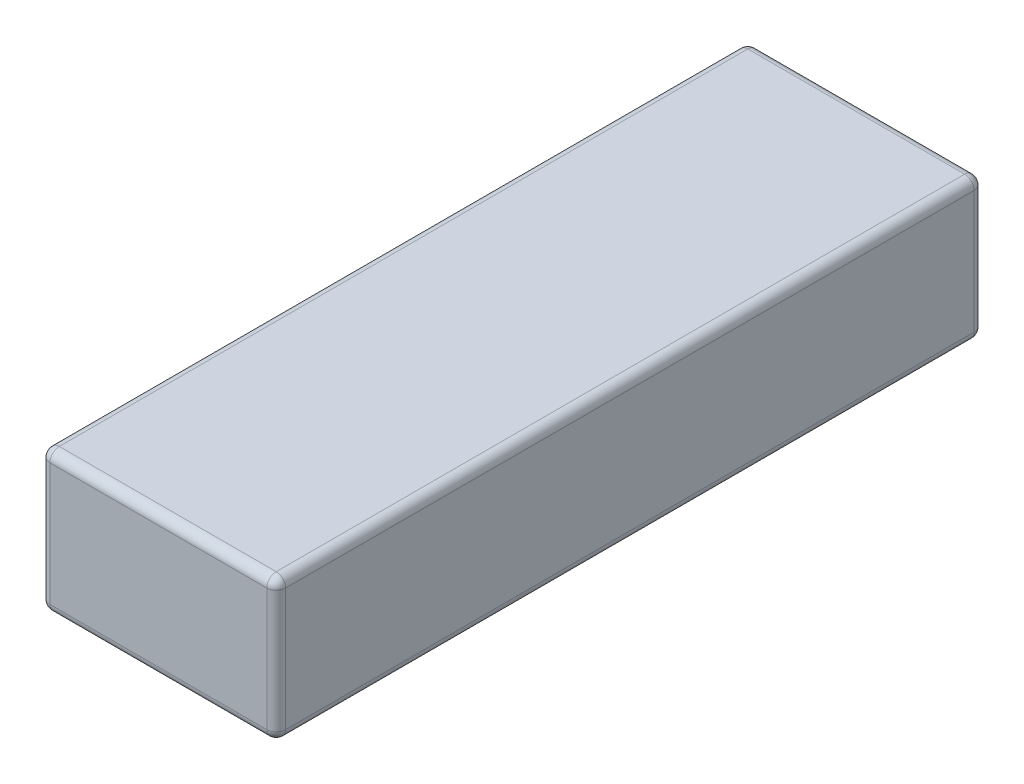
ISO-10303-21;
HEADER;
FILE_DESCRIPTION(('STEP AP214'),'2;1');
FILE_NAME('part.step','',(''),(''),'','','');
FILE_SCHEMA(('AUTOMOTIVE_DESIGN { 1 0 10303 214 1 1 1 1 }'));
ENDSEC;
DATA;
#1=APPLICATION_CONTEXT('core data for automotive mechanical design processes');
#2=APPLICATION_PROTOCOL_DEFINITION('international standard','automotive_design',2000,#1);
#3=PRODUCT_CONTEXT('',#1,'mechanical');
#4=PRODUCT('Part','Part','',(#3));
#5=PRODUCT_RELATED_PRODUCT_CATEGORY('part','',(#4));
#6=PRODUCT_DEFINITION_FORMATION('','',#4);
#7=PRODUCT_DEFINITION_CONTEXT('part definition',#1,'design');
#8=PRODUCT_DEFINITION('design','',#6,#7);
#9=PRODUCT_DEFINITION_SHAPE('','',#8);
#10=(LENGTH_UNIT() NAMED_UNIT(*) SI_UNIT(.MILLI.,.METRE.));
#11=(NAMED_UNIT(*) PLANE_ANGLE_UNIT() SI_UNIT($,.RADIAN.));
#12=(NAMED_UNIT(*) SI_UNIT($,.STERADIAN.) SOLID_ANGLE_UNIT());
#13=UNCERTAINTY_MEASURE_WITH_UNIT(LENGTH_MEASURE(1.E-05),#10,'distance_accuracy_value','');
#14=(GEOMETRIC_REPRESENTATION_CONTEXT(3) GLOBAL_UNCERTAINTY_ASSIGNED_CONTEXT((#13)) GLOBAL_UNIT_ASSIGNED_CONTEXT((#10,
#11,#12)) REPRESENTATION_CONTEXT('',''));
#15=CARTESIAN_POINT('',(0.,0.,0.));
#16=DIRECTION('',(0.,0.,1.));
#17=DIRECTION('',(1.,0.,0.));
#18=AXIS2_PLACEMENT_3D('',#15,#16,#17);
#19=CARTESIAN_POINT('',(25.,30.,-75.));
#20=DIRECTION('',(-1.,0.,0.));
#21=DIRECTION('',(0.,0.,1.));
#22=AXIS2_PLACEMENT_3D('',#19,#20,#21);
#23=PLANE('',#22);
#24=DIRECTION('',(0.,-1.,0.));
#25=VECTOR('',#24,1.);
#26=CARTESIAN_POINT('',(25.,30.,73.));
#27=LINE('',#26,#25);
#28=CARTESIAN_POINT('',(25.,28.,73.));
#29=VERTEX_POINT('',#28);
#30=CARTESIAN_POINT('',(25.,2.,73.));
#31=VERTEX_POINT('',#30);
#32=EDGE_CURVE('E142',#29,#31,#27,.T.);
#33=ORIENTED_EDGE('',*,*,#32,.T.);
#34=DIRECTION('',(0.,0.,-1.));
#35=VECTOR('',#34,1.);
#36=CARTESIAN_POINT('',(25.,2.,-75.));
#37=LINE('',#36,#35);
#38=CARTESIAN_POINT('',(25.,2.,-73.));
#39=VERTEX_POINT('',#38);
#40=EDGE_CURVE('E137',#31,#39,#37,.T.);
#41=ORIENTED_EDGE('',*,*,#40,.T.);
#42=DIRECTION('',(0.,-1.,0.));
#43=VECTOR('',#42,1.);
#44=CARTESIAN_POINT('',(25.,30.,-73.));
#45=LINE('',#44,#43);
#46=CARTESIAN_POINT('',(25.,28.,-73.));
#47=VERTEX_POINT('',#46);
#48=EDGE_CURVE('E132',#39,#47,#45,.F.);
#49=ORIENTED_EDGE('',*,*,#48,.T.);
#50=DIRECTION('',(0.,0.,-1.));
#51=VECTOR('',#50,1.);
#52=CARTESIAN_POINT('',(25.,28.,75.));
#53=LINE('',#52,#51);
#54=EDGE_CURVE('E134',#47,#29,#53,.F.);
#55=ORIENTED_EDGE('',*,*,#54,.T.);
#56=EDGE_LOOP('',(#33,#41,#49,#55));
#57=FACE_BOUND('',#56,.T.);
#58=ADVANCED_FACE('F43',(#57),#23,.F.);
#59=CARTESIAN_POINT('',(-25.,30.,-75.));
#60=DIRECTION('',(0.,0.,1.));
#61=DIRECTION('',(1.,0.,0.));
#62=AXIS2_PLACEMENT_3D('',#59,#60,#61);
#63=PLANE('',#62);
#64=DIRECTION('',(-1.,0.,0.));
#65=VECTOR('',#64,1.);
#66=CARTESIAN_POINT('',(25.,28.,-75.));
#67=LINE('',#66,#65);
#68=CARTESIAN_POINT('',(-23.,28.,-75.));
#69=VERTEX_POINT('',#68);
#70=CARTESIAN_POINT('',(23.,28.,-75.));
#71=VERTEX_POINT('',#70);
#72=EDGE_CURVE('E267',#69,#71,#67,.F.);
#73=ORIENTED_EDGE('',*,*,#72,.T.);
#74=DIRECTION('',(0.,-1.,0.));
#75=VECTOR('',#74,1.);
#76=CARTESIAN_POINT('',(23.,30.,-75.));
#77=LINE('',#76,#75);
#78=CARTESIAN_POINT('',(23.,2.,-75.));
#79=VERTEX_POINT('',#78);
#80=EDGE_CURVE('E166',#71,#79,#77,.T.);
#81=ORIENTED_EDGE('',*,*,#80,.T.);
#82=DIRECTION('',(-1.,0.,0.));
#83=VECTOR('',#82,1.);
#84=CARTESIAN_POINT('',(-25.,2.,-75.));
#85=LINE('',#84,#83);
#86=CARTESIAN_POINT('',(-23.,2.,-75.));
#87=VERTEX_POINT('',#86);
#88=EDGE_CURVE('E270',#79,#87,#85,.T.);
#89=ORIENTED_EDGE('',*,*,#88,.T.);
#90=DIRECTION('',(0.,-1.,0.));
#91=VECTOR('',#90,1.);
#92=CARTESIAN_POINT('',(-23.,30.,-75.));
#93=LINE('',#92,#91);
#94=EDGE_CURVE('E264',#87,#69,#93,.F.);
#95=ORIENTED_EDGE('',*,*,#94,.T.);
#96=EDGE_LOOP('',(#73,#81,#89,#95));
#97=FACE_BOUND('',#96,.T.);
#98=ADVANCED_FACE('F341',(#97),#63,.F.);
#99=CARTESIAN_POINT('',(-25.,30.,-75.));
#100=DIRECTION('',(1.,0.,0.));
#101=DIRECTION('',(0.,0.,-1.));
#102=AXIS2_PLACEMENT_3D('',#99,#100,#101);
#103=PLANE('',#102);
#104=DIRECTION('',(0.,0.,1.));
#105=VECTOR('',#104,1.);
#106=CARTESIAN_POINT('',(-25.,28.,-75.));
#107=LINE('',#106,#105);
#108=CARTESIAN_POINT('',(-25.,28.,73.));
#109=VERTEX_POINT('',#108);
#110=CARTESIAN_POINT('',(-25.,28.,-73.));
#111=VERTEX_POINT('',#110);
#112=EDGE_CURVE('E53',#109,#111,#107,.F.);
#113=ORIENTED_EDGE('',*,*,#112,.T.);
#114=DIRECTION('',(0.,-1.,0.));
#115=VECTOR('',#114,1.);
#116=CARTESIAN_POINT('',(-25.,30.,-73.));
#117=LINE('',#116,#115);
#118=CARTESIAN_POINT('',(-25.,2.,-73.));
#119=VERTEX_POINT('',#118);
#120=EDGE_CURVE('E11',#111,#119,#117,.T.);
#121=ORIENTED_EDGE('',*,*,#120,.T.);
#122=DIRECTION('',(0.,0.,1.));
#123=VECTOR('',#122,1.);
#124=CARTESIAN_POINT('',(-25.,2.,-75.));
#125=LINE('',#124,#123);
#126=CARTESIAN_POINT('',(-25.,2.,73.));
#127=VERTEX_POINT('',#126);
#128=EDGE_CURVE('E288',#119,#127,#125,.T.);
#129=ORIENTED_EDGE('',*,*,#128,.T.);
#130=DIRECTION('',(0.,-1.,0.));
#131=VECTOR('',#130,1.);
#132=CARTESIAN_POINT('',(-25.,30.,73.));
#133=LINE('',#132,#131);
#134=EDGE_CURVE('E64',#127,#109,#133,.F.);
#135=ORIENTED_EDGE('',*,*,#134,.T.);
#136=EDGE_LOOP('',(#113,#121,#129,#135));
#137=FACE_BOUND('',#136,.T.);
#138=ADVANCED_FACE('F354',(#137),#103,.F.);
#139=CARTESIAN_POINT('',(-25.,30.,75.));
#140=DIRECTION('',(0.,0.,-1.));
#141=DIRECTION('',(-1.,0.,0.));
#142=AXIS2_PLACEMENT_3D('',#139,#140,#141);
#143=PLANE('',#142);
#144=DIRECTION('',(1.,0.,0.));
#145=VECTOR('',#144,1.);
#146=CARTESIAN_POINT('',(-25.,2.,75.));
#147=LINE('',#146,#145);
#148=CARTESIAN_POINT('',(-23.,2.,75.));
#149=VERTEX_POINT('',#148);
#150=CARTESIAN_POINT('',(23.,2.,75.));
#151=VERTEX_POINT('',#150);
#152=EDGE_CURVE('E251',#149,#151,#147,.T.);
#153=ORIENTED_EDGE('',*,*,#152,.T.);
#154=DIRECTION('',(0.,-1.,0.));
#155=VECTOR('',#154,1.);
#156=CARTESIAN_POINT('',(23.,30.,75.));
#157=LINE('',#156,#155);
#158=CARTESIAN_POINT('',(23.,28.,75.));
#159=VERTEX_POINT('',#158);
#160=EDGE_CURVE('E260',#151,#159,#157,.F.);
#161=ORIENTED_EDGE('',*,*,#160,.T.);
#162=DIRECTION('',(1.,0.,0.));
#163=VECTOR('',#162,1.);
#164=CARTESIAN_POINT('',(-25.,28.,75.));
#165=LINE('',#164,#163);
#166=CARTESIAN_POINT('',(-23.,28.,75.));
#167=VERTEX_POINT('',#166);
#168=EDGE_CURVE('E246',#159,#167,#165,.F.);
#169=ORIENTED_EDGE('',*,*,#168,.T.);
#170=DIRECTION('',(0.,-1.,0.));
#171=VECTOR('',#170,1.);
#172=CARTESIAN_POINT('',(-23.,30.,75.));
#173=LINE('',#172,#171);
#174=EDGE_CURVE('E242',#167,#149,#173,.T.);
#175=ORIENTED_EDGE('',*,*,#174,.T.);
#176=EDGE_LOOP('',(#153,#161,#169,#175));
#177=FACE_BOUND('',#176,.T.);
#178=ADVANCED_FACE('F362',(#177),#143,.F.);
#179=CARTESIAN_POINT('',(0.,30.,0.));
#180=DIRECTION('',(0.,1.,0.));
#181=DIRECTION('',(0.,0.,1.));
#182=AXIS2_PLACEMENT_3D('',#179,#180,#181);
#183=PLANE('',#182);
#184=DIRECTION('',(1.,0.,0.));
#185=VECTOR('',#184,1.);
#186=CARTESIAN_POINT('',(25.,30.,73.));
#187=LINE('',#186,#185);
#188=CARTESIAN_POINT('',(-23.,30.,73.));
#189=VERTEX_POINT('',#188);
#190=CARTESIAN_POINT('',(23.,30.,73.));
#191=VERTEX_POINT('',#190);
#192=EDGE_CURVE('E281',#189,#191,#187,.T.);
#193=ORIENTED_EDGE('',*,*,#192,.T.);
#194=DIRECTION('',(0.,0.,-1.));
#195=VECTOR('',#194,1.);
#196=CARTESIAN_POINT('',(23.,30.,-75.));
#197=LINE('',#196,#195);
#198=CARTESIAN_POINT('',(23.,30.,-73.));
#199=VERTEX_POINT('',#198);
#200=EDGE_CURVE('E285',#191,#199,#197,.T.);
#201=ORIENTED_EDGE('',*,*,#200,.T.);
#202=DIRECTION('',(-1.,0.,0.));
#203=VECTOR('',#202,1.);
#204=CARTESIAN_POINT('',(-25.,30.,-73.));
#205=LINE('',#204,#203);
#206=CARTESIAN_POINT('',(-23.,30.,-73.));
#207=VERTEX_POINT('',#206);
#208=EDGE_CURVE('E278',#199,#207,#205,.T.);
#209=ORIENTED_EDGE('',*,*,#208,.T.);
#210=DIRECTION('',(0.,0.,1.));
#211=VECTOR('',#210,1.);
#212=CARTESIAN_POINT('',(-23.,30.,75.));
#213=LINE('',#212,#211);
#214=EDGE_CURVE('E275',#207,#189,#213,.T.);
#215=ORIENTED_EDGE('',*,*,#214,.T.);
#216=EDGE_LOOP('',(#193,#201,#209,#215));
#217=FACE_BOUND('',#216,.T.);
#218=ADVANCED_FACE('F347',(#217),#183,.T.);
#219=CARTESIAN_POINT('',(0.,0.,0.));
#220=DIRECTION('',(0.,1.,0.));
#221=DIRECTION('',(0.,0.,1.));
#222=AXIS2_PLACEMENT_3D('',#219,#220,#221);
#223=PLANE('',#222);
#224=DIRECTION('',(-1.,0.,0.));
#225=VECTOR('',#224,1.);
#226=CARTESIAN_POINT('',(0.,0.,-73.));
#227=LINE('',#226,#225);
#228=CARTESIAN_POINT('',(-23.,0.,-73.));
#229=VERTEX_POINT('',#228);
#230=CARTESIAN_POINT('',(23.,0.,-73.));
#231=VERTEX_POINT('',#230);
#232=EDGE_CURVE('E325',#229,#231,#227,.F.);
#233=ORIENTED_EDGE('',*,*,#232,.T.);
#234=DIRECTION('',(0.,0.,-1.));
#235=VECTOR('',#234,1.);
#236=CARTESIAN_POINT('',(23.,0.,0.));
#237=LINE('',#236,#235);
#238=CARTESIAN_POINT('',(23.,0.,73.));
#239=VERTEX_POINT('',#238);
#240=EDGE_CURVE('E247',#231,#239,#237,.F.);
#241=ORIENTED_EDGE('',*,*,#240,.T.);
#242=DIRECTION('',(1.,0.,0.));
#243=VECTOR('',#242,1.);
#244=CARTESIAN_POINT('',(0.,0.,73.));
#245=LINE('',#244,#243);
#246=CARTESIAN_POINT('',(-23.,0.,73.));
#247=VERTEX_POINT('',#246);
#248=EDGE_CURVE('E254',#239,#247,#245,.F.);
#249=ORIENTED_EDGE('',*,*,#248,.T.);
#250=DIRECTION('',(0.,0.,1.));
#251=VECTOR('',#250,1.);
#252=CARTESIAN_POINT('',(-23.,0.,0.));
#253=LINE('',#252,#251);
#254=EDGE_CURVE('E358',#247,#229,#253,.F.);
#255=ORIENTED_EDGE('',*,*,#254,.T.);
#256=EDGE_LOOP('',(#233,#241,#249,#255));
#257=FACE_BOUND('',#256,.T.);
#258=ADVANCED_FACE('F327',(#257),#223,.F.);
#259=CARTESIAN_POINT('',(-23.,28.,0.));
#260=DIRECTION('',(0.,0.,-1.));
#261=DIRECTION('',(-1.,0.,0.));
#262=AXIS2_PLACEMENT_3D('',#259,#260,#261);
#263=CYLINDRICAL_SURFACE('',#262,2.);
#264=CARTESIAN_POINT('',(-23.,28.,73.));
#265=DIRECTION('',(0.,0.,1.));
#266=DIRECTION('',(1.,0.,0.));
#267=AXIS2_PLACEMENT_3D('',#264,#265,#266);
#268=CIRCLE('',#267,2.);
#269=EDGE_CURVE('E47',#189,#109,#268,.T.);
#270=ORIENTED_EDGE('',*,*,#269,.F.);
#271=ORIENTED_EDGE('',*,*,#214,.F.);
#272=CARTESIAN_POINT('',(-23.,28.,-73.));
#273=DIRECTION('',(0.,0.,-1.));
#274=DIRECTION('',(-1.,0.,0.));
#275=AXIS2_PLACEMENT_3D('',#272,#273,#274);
#276=CIRCLE('',#275,2.);
#277=EDGE_CURVE('E221',#111,#207,#276,.T.);
#278=ORIENTED_EDGE('',*,*,#277,.F.);
#279=ORIENTED_EDGE('',*,*,#112,.F.);
#280=EDGE_LOOP('',(#270,#271,#278,#279));
#281=FACE_BOUND('',#280,.T.);
#282=ADVANCED_FACE('F45',(#281),#263,.T.);
#283=CARTESIAN_POINT('',(-23.,28.,73.));
#284=DIRECTION('',(-1.,0.,0.));
#285=DIRECTION('',(0.,0.,1.));
#286=AXIS2_PLACEMENT_3D('',#283,#284,#285);
#287=SPHERICAL_SURFACE('',#286,2.);
#288=CARTESIAN_POINT('',(-23.,28.,73.));
#289=DIRECTION('',(-1.,0.,0.));
#290=DIRECTION('',(0.,0.,1.));
#291=AXIS2_PLACEMENT_3D('',#288,#289,#290);
#292=CIRCLE('',#291,2.);
#293=EDGE_CURVE('E214',#189,#167,#292,.F.);
#294=ORIENTED_EDGE('',*,*,#293,.F.);
#295=ORIENTED_EDGE('',*,*,#269,.T.);
#296=CARTESIAN_POINT('',(-23.,28.,73.));
#297=DIRECTION('',(0.,1.,0.));
#298=DIRECTION('',(0.,0.,1.));
#299=AXIS2_PLACEMENT_3D('',#296,#297,#298);
#300=CIRCLE('',#299,2.);
#301=EDGE_CURVE('E218',#167,#109,#300,.F.);
#302=ORIENTED_EDGE('',*,*,#301,.F.);
#303=EDGE_LOOP('',(#294,#295,#302));
#304=FACE_BOUND('',#303,.T.);
#305=ADVANCED_FACE('F233',(#304),#287,.T.);
#306=CARTESIAN_POINT('',(-23.,28.,-73.));
#307=DIRECTION('',(0.,1.,0.));
#308=DIRECTION('',(0.,0.,1.));
#309=AXIS2_PLACEMENT_3D('',#306,#307,#308);
#310=SPHERICAL_SURFACE('',#309,2.);
#311=CARTESIAN_POINT('',(-23.,28.,-73.));
#312=DIRECTION('',(0.,1.,0.));
#313=DIRECTION('',(0.,0.,1.));
#314=AXIS2_PLACEMENT_3D('',#311,#312,#313);
#315=CIRCLE('',#314,2.);
#316=EDGE_CURVE('E206',#111,#69,#315,.F.);
#317=ORIENTED_EDGE('',*,*,#316,.F.);
#318=ORIENTED_EDGE('',*,*,#277,.T.);
#319=CARTESIAN_POINT('',(-23.,28.,-73.));
#320=DIRECTION('',(-1.,0.,0.));
#321=DIRECTION('',(0.,0.,1.));
#322=AXIS2_PLACEMENT_3D('',#319,#320,#321);
#323=CIRCLE('',#322,2.);
#324=EDGE_CURVE('E210',#69,#207,#323,.F.);
#325=ORIENTED_EDGE('',*,*,#324,.F.);
#326=EDGE_LOOP('',(#317,#318,#325));
#327=FACE_BOUND('',#326,.T.);
#328=ADVANCED_FACE('F349',(#327),#310,.T.);
#329=CARTESIAN_POINT('',(-23.,30.,73.));
#330=DIRECTION('',(0.,-1.,0.));
#331=DIRECTION('',(0.,0.,-1.));
#332=AXIS2_PLACEMENT_3D('',#329,#330,#331);
#333=CYLINDRICAL_SURFACE('',#332,2.);
#334=ORIENTED_EDGE('',*,*,#301,.T.);
#335=ORIENTED_EDGE('',*,*,#134,.F.);
#336=CARTESIAN_POINT('',(-23.,2.,73.));
#337=DIRECTION('',(0.,-1.,0.));
#338=DIRECTION('',(0.,0.,-1.));
#339=AXIS2_PLACEMENT_3D('',#336,#337,#338);
#340=CIRCLE('',#339,2.);
#341=EDGE_CURVE('E198',#149,#127,#340,.T.);
#342=ORIENTED_EDGE('',*,*,#341,.F.);
#343=ORIENTED_EDGE('',*,*,#174,.F.);
#344=EDGE_LOOP('',(#334,#335,#342,#343));
#345=FACE_BOUND('',#344,.T.);
#346=ADVANCED_FACE('F239',(#345),#333,.T.);
#347=CARTESIAN_POINT('',(0.,28.,73.));
#348=DIRECTION('',(-1.,0.,0.));
#349=DIRECTION('',(0.,0.,1.));
#350=AXIS2_PLACEMENT_3D('',#347,#348,#349);
#351=CYLINDRICAL_SURFACE('',#350,2.);
#352=ORIENTED_EDGE('',*,*,#293,.T.);
#353=ORIENTED_EDGE('',*,*,#168,.F.);
#354=CARTESIAN_POINT('',(23.,28.,73.));
#355=DIRECTION('',(1.,0.,0.));
#356=DIRECTION('',(0.,0.,-1.));
#357=AXIS2_PLACEMENT_3D('',#354,#355,#356);
#358=CIRCLE('',#357,2.);
#359=EDGE_CURVE('E194',#191,#159,#358,.T.);
#360=ORIENTED_EDGE('',*,*,#359,.F.);
#361=ORIENTED_EDGE('',*,*,#192,.F.);
#362=EDGE_LOOP('',(#352,#353,#360,#361));
#363=FACE_BOUND('',#362,.T.);
#364=ADVANCED_FACE('F371',(#363),#351,.T.);
#365=CARTESIAN_POINT('',(23.,28.,0.));
#366=DIRECTION('',(0.,0.,1.));
#367=DIRECTION('',(1.,0.,0.));
#368=AXIS2_PLACEMENT_3D('',#365,#366,#367);
#369=CYLINDRICAL_SURFACE('',#368,2.);
#370=CARTESIAN_POINT('',(23.,28.,-73.));
#371=DIRECTION('',(0.,0.,-1.));
#372=DIRECTION('',(-1.,0.,0.));
#373=AXIS2_PLACEMENT_3D('',#370,#371,#372);
#374=CIRCLE('',#373,2.);
#375=EDGE_CURVE('E149',#199,#47,#374,.T.);
#376=ORIENTED_EDGE('',*,*,#375,.F.);
#377=ORIENTED_EDGE('',*,*,#200,.F.);
#378=CARTESIAN_POINT('',(23.,28.,73.));
#379=DIRECTION('',(0.,0.,1.));
#380=DIRECTION('',(1.,0.,0.));
#381=AXIS2_PLACEMENT_3D('',#378,#379,#380);
#382=CIRCLE('',#381,2.);
#383=EDGE_CURVE('E151',#29,#191,#382,.T.);
#384=ORIENTED_EDGE('',*,*,#383,.F.);
#385=ORIENTED_EDGE('',*,*,#54,.F.);
#386=EDGE_LOOP('',(#376,#377,#384,#385));
#387=FACE_BOUND('',#386,.T.);
#388=ADVANCED_FACE('F147',(#387),#369,.T.);
#389=CARTESIAN_POINT('',(0.,28.,-73.));
#390=DIRECTION('',(1.,0.,0.));
#391=DIRECTION('',(0.,0.,-1.));
#392=AXIS2_PLACEMENT_3D('',#389,#390,#391);
#393=CYLINDRICAL_SURFACE('',#392,2.);
#394=ORIENTED_EDGE('',*,*,#324,.T.);
#395=ORIENTED_EDGE('',*,*,#208,.F.);
#396=CARTESIAN_POINT('',(23.,28.,-73.));
#397=DIRECTION('',(1.,0.,0.));
#398=DIRECTION('',(0.,0.,-1.));
#399=AXIS2_PLACEMENT_3D('',#396,#397,#398);
#400=CIRCLE('',#399,2.);
#401=EDGE_CURVE('E161',#71,#199,#400,.T.);
#402=ORIENTED_EDGE('',*,*,#401,.F.);
#403=ORIENTED_EDGE('',*,*,#72,.F.);
#404=EDGE_LOOP('',(#394,#395,#402,#403));
#405=FACE_BOUND('',#404,.T.);
#406=ADVANCED_FACE('F345',(#405),#393,.T.);
#407=CARTESIAN_POINT('',(-23.,30.,-73.));
#408=DIRECTION('',(0.,-1.,0.));
#409=DIRECTION('',(0.,0.,-1.));
#410=AXIS2_PLACEMENT_3D('',#407,#408,#409);
#411=CYLINDRICAL_SURFACE('',#410,2.);
#412=ORIENTED_EDGE('',*,*,#316,.T.);
#413=ORIENTED_EDGE('',*,*,#94,.F.);
#414=CARTESIAN_POINT('',(-23.,2.,-73.));
#415=DIRECTION('',(0.,-1.,0.));
#416=DIRECTION('',(0.,0.,-1.));
#417=AXIS2_PLACEMENT_3D('',#414,#415,#416);
#418=CIRCLE('',#417,2.);
#419=EDGE_CURVE('E186',#119,#87,#418,.T.);
#420=ORIENTED_EDGE('',*,*,#419,.F.);
#421=ORIENTED_EDGE('',*,*,#120,.F.);
#422=EDGE_LOOP('',(#412,#413,#420,#421));
#423=FACE_BOUND('',#422,.T.);
#424=ADVANCED_FACE('F352',(#423),#411,.T.);
#425=CARTESIAN_POINT('',(-23.,2.,-75.));
#426=DIRECTION('',(0.,0.,1.));
#427=DIRECTION('',(1.,0.,0.));
#428=AXIS2_PLACEMENT_3D('',#425,#426,#427);
#429=CYLINDRICAL_SURFACE('',#428,2.);
#430=CARTESIAN_POINT('',(-23.,2.,73.));
#431=DIRECTION('',(0.,0.,1.));
#432=DIRECTION('',(1.,0.,0.));
#433=AXIS2_PLACEMENT_3D('',#430,#431,#432);
#434=CIRCLE('',#433,2.);
#435=EDGE_CURVE('E202',#127,#247,#434,.T.);
#436=ORIENTED_EDGE('',*,*,#435,.F.);
#437=ORIENTED_EDGE('',*,*,#128,.F.);
#438=CARTESIAN_POINT('',(-23.,2.,-73.));
#439=DIRECTION('',(0.,0.,-1.));
#440=DIRECTION('',(-1.,0.,0.));
#441=AXIS2_PLACEMENT_3D('',#438,#439,#440);
#442=CIRCLE('',#441,2.);
#443=EDGE_CURVE('E183',#229,#119,#442,.T.);
#444=ORIENTED_EDGE('',*,*,#443,.F.);
#445=ORIENTED_EDGE('',*,*,#254,.F.);
#446=EDGE_LOOP('',(#436,#437,#444,#445));
#447=FACE_BOUND('',#446,.T.);
#448=ADVANCED_FACE('F357',(#447),#429,.T.);
#449=CARTESIAN_POINT('',(-23.,2.,73.));
#450=DIRECTION('',(-1.,0.,0.));
#451=DIRECTION('',(0.,-1.,0.));
#452=AXIS2_PLACEMENT_3D('',#449,#450,#451);
#453=SPHERICAL_SURFACE('',#452,2.);
#454=ORIENTED_EDGE('',*,*,#341,.T.);
#455=ORIENTED_EDGE('',*,*,#435,.T.);
#456=CARTESIAN_POINT('',(-23.,2.,73.));
#457=DIRECTION('',(-1.,0.,0.));
#458=DIRECTION('',(0.,0.,1.));
#459=AXIS2_PLACEMENT_3D('',#456,#457,#458);
#460=CIRCLE('',#459,2.);
#461=EDGE_CURVE('E173',#149,#247,#460,.F.);
#462=ORIENTED_EDGE('',*,*,#461,.F.);
#463=EDGE_LOOP('',(#454,#455,#462));
#464=FACE_BOUND('',#463,.T.);
#465=ADVANCED_FACE('F360',(#464),#453,.T.);
#466=CARTESIAN_POINT('',(23.,28.,73.));
#467=DIRECTION('',(0.,1.,0.));
#468=DIRECTION('',(0.,0.,1.));
#469=AXIS2_PLACEMENT_3D('',#466,#467,#468);
#470=SPHERICAL_SURFACE('',#469,2.);
#471=ORIENTED_EDGE('',*,*,#383,.T.);
#472=ORIENTED_EDGE('',*,*,#359,.T.);
#473=CARTESIAN_POINT('',(23.,28.,73.));
#474=DIRECTION('',(0.,1.,0.));
#475=DIRECTION('',(0.,0.,1.));
#476=AXIS2_PLACEMENT_3D('',#473,#474,#475);
#477=CIRCLE('',#476,2.);
#478=EDGE_CURVE('E168',#29,#159,#477,.F.);
#479=ORIENTED_EDGE('',*,*,#478,.F.);
#480=EDGE_LOOP('',(#471,#472,#479));
#481=FACE_BOUND('',#480,.T.);
#482=ADVANCED_FACE('F369',(#481),#470,.T.);
#483=CARTESIAN_POINT('',(23.,28.,-73.));
#484=DIRECTION('',(0.,1.,0.));
#485=DIRECTION('',(0.,0.,1.));
#486=AXIS2_PLACEMENT_3D('',#483,#484,#485);
#487=SPHERICAL_SURFACE('',#486,2.);
#488=ORIENTED_EDGE('',*,*,#401,.T.);
#489=ORIENTED_EDGE('',*,*,#375,.T.);
#490=CARTESIAN_POINT('',(23.,28.,-73.));
#491=DIRECTION('',(0.,1.,0.));
#492=DIRECTION('',(0.,0.,1.));
#493=AXIS2_PLACEMENT_3D('',#490,#491,#492);
#494=CIRCLE('',#493,2.);
#495=EDGE_CURVE('E158',#71,#47,#494,.F.);
#496=ORIENTED_EDGE('',*,*,#495,.F.);
#497=EDGE_LOOP('',(#488,#489,#496));
#498=FACE_BOUND('',#497,.T.);
#499=ADVANCED_FACE('F157',(#498),#487,.T.);
#500=CARTESIAN_POINT('',(-23.,2.,-73.));
#501=DIRECTION('',(-1.,0.,0.));
#502=DIRECTION('',(0.,-1.,0.));
#503=AXIS2_PLACEMENT_3D('',#500,#501,#502);
#504=SPHERICAL_SURFACE('',#503,2.);
#505=ORIENTED_EDGE('',*,*,#443,.T.);
#506=ORIENTED_EDGE('',*,*,#419,.T.);
#507=CARTESIAN_POINT('',(-23.,2.,-73.));
#508=DIRECTION('',(-1.,0.,0.));
#509=DIRECTION('',(0.,0.,1.));
#510=AXIS2_PLACEMENT_3D('',#507,#508,#509);
#511=CIRCLE('',#510,2.);
#512=EDGE_CURVE('E169',#229,#87,#511,.F.);
#513=ORIENTED_EDGE('',*,*,#512,.F.);
#514=EDGE_LOOP('',(#505,#506,#513));
#515=FACE_BOUND('',#514,.T.);
#516=ADVANCED_FACE('F402',(#515),#504,.T.);
#517=CARTESIAN_POINT('',(-25.,2.,73.));
#518=DIRECTION('',(1.,0.,0.));
#519=DIRECTION('',(0.,0.,-1.));
#520=AXIS2_PLACEMENT_3D('',#517,#518,#519);
#521=CYLINDRICAL_SURFACE('',#520,2.);
#522=ORIENTED_EDGE('',*,*,#461,.T.);
#523=ORIENTED_EDGE('',*,*,#248,.F.);
#524=CARTESIAN_POINT('',(23.,2.,73.));
#525=DIRECTION('',(1.,0.,0.));
#526=DIRECTION('',(0.,0.,-1.));
#527=AXIS2_PLACEMENT_3D('',#524,#525,#526);
#528=CIRCLE('',#527,2.);
#529=EDGE_CURVE('E176',#151,#239,#528,.T.);
#530=ORIENTED_EDGE('',*,*,#529,.F.);
#531=ORIENTED_EDGE('',*,*,#152,.F.);
#532=EDGE_LOOP('',(#522,#523,#530,#531));
#533=FACE_BOUND('',#532,.T.);
#534=ADVANCED_FACE('F321',(#533),#521,.T.);
#535=CARTESIAN_POINT('',(23.,30.,73.));
#536=DIRECTION('',(0.,-1.,0.));
#537=DIRECTION('',(0.,0.,-1.));
#538=AXIS2_PLACEMENT_3D('',#535,#536,#537);
#539=CYLINDRICAL_SURFACE('',#538,2.);
#540=ORIENTED_EDGE('',*,*,#478,.T.);
#541=ORIENTED_EDGE('',*,*,#160,.F.);
#542=CARTESIAN_POINT('',(23.,2.,73.));
#543=DIRECTION('',(0.,-1.,0.));
#544=DIRECTION('',(0.,0.,-1.));
#545=AXIS2_PLACEMENT_3D('',#542,#543,#544);
#546=CIRCLE('',#545,2.);
#547=EDGE_CURVE('E308',#31,#151,#546,.T.);
#548=ORIENTED_EDGE('',*,*,#547,.F.);
#549=ORIENTED_EDGE('',*,*,#32,.F.);
#550=EDGE_LOOP('',(#540,#541,#548,#549));
#551=FACE_BOUND('',#550,.T.);
#552=ADVANCED_FACE('F364',(#551),#539,.T.);
#553=CARTESIAN_POINT('',(23.,30.,-73.));
#554=DIRECTION('',(0.,-1.,0.));
#555=DIRECTION('',(0.,0.,-1.));
#556=AXIS2_PLACEMENT_3D('',#553,#554,#555);
#557=CYLINDRICAL_SURFACE('',#556,2.);
#558=ORIENTED_EDGE('',*,*,#495,.T.);
#559=ORIENTED_EDGE('',*,*,#48,.F.);
#560=CARTESIAN_POINT('',(23.,2.,-73.));
#561=DIRECTION('',(0.,-1.,0.));
#562=DIRECTION('',(0.,0.,-1.));
#563=AXIS2_PLACEMENT_3D('',#560,#561,#562);
#564=CIRCLE('',#563,2.);
#565=EDGE_CURVE('E304',#79,#39,#564,.T.);
#566=ORIENTED_EDGE('',*,*,#565,.F.);
#567=ORIENTED_EDGE('',*,*,#80,.F.);
#568=EDGE_LOOP('',(#558,#559,#566,#567));
#569=FACE_BOUND('',#568,.T.);
#570=ADVANCED_FACE('F164',(#569),#557,.T.);
#571=CARTESIAN_POINT('',(-25.,2.,-73.));
#572=DIRECTION('',(-1.,0.,0.));
#573=DIRECTION('',(0.,0.,1.));
#574=AXIS2_PLACEMENT_3D('',#571,#572,#573);
#575=CYLINDRICAL_SURFACE('',#574,2.);
#576=ORIENTED_EDGE('',*,*,#512,.T.);
#577=ORIENTED_EDGE('',*,*,#88,.F.);
#578=CARTESIAN_POINT('',(23.,2.,-73.));
#579=DIRECTION('',(1.,0.,0.));
#580=DIRECTION('',(0.,0.,-1.));
#581=AXIS2_PLACEMENT_3D('',#578,#579,#580);
#582=CIRCLE('',#581,2.);
#583=EDGE_CURVE('E301',#231,#79,#582,.T.);
#584=ORIENTED_EDGE('',*,*,#583,.F.);
#585=ORIENTED_EDGE('',*,*,#232,.F.);
#586=EDGE_LOOP('',(#576,#577,#584,#585));
#587=FACE_BOUND('',#586,.T.);
#588=ADVANCED_FACE('F337',(#587),#575,.T.);
#589=CARTESIAN_POINT('',(23.,2.,73.));
#590=DIRECTION('',(0.,0.,1.));
#591=DIRECTION('',(0.,-1.,0.));
#592=AXIS2_PLACEMENT_3D('',#589,#590,#591);
#593=SPHERICAL_SURFACE('',#592,2.);
#594=ORIENTED_EDGE('',*,*,#547,.T.);
#595=ORIENTED_EDGE('',*,*,#529,.T.);
#596=CARTESIAN_POINT('',(23.,2.,73.));
#597=DIRECTION('',(0.,0.,1.));
#598=DIRECTION('',(1.,0.,0.));
#599=AXIS2_PLACEMENT_3D('',#596,#597,#598);
#600=CIRCLE('',#599,2.);
#601=EDGE_CURVE('E298',#31,#239,#600,.F.);
#602=ORIENTED_EDGE('',*,*,#601,.F.);
#603=EDGE_LOOP('',(#594,#595,#602));
#604=FACE_BOUND('',#603,.T.);
#605=ADVANCED_FACE('F317',(#604),#593,.T.);
#606=CARTESIAN_POINT('',(23.,2.,-73.));
#607=DIRECTION('',(0.,0.,-1.));
#608=DIRECTION('',(0.,1.,0.));
#609=AXIS2_PLACEMENT_3D('',#606,#607,#608);
#610=SPHERICAL_SURFACE('',#609,2.);
#611=ORIENTED_EDGE('',*,*,#583,.T.);
#612=ORIENTED_EDGE('',*,*,#565,.T.);
#613=CARTESIAN_POINT('',(23.,2.,-73.));
#614=DIRECTION('',(0.,0.,-1.));
#615=DIRECTION('',(-1.,0.,0.));
#616=AXIS2_PLACEMENT_3D('',#613,#614,#615);
#617=CIRCLE('',#616,2.);
#618=EDGE_CURVE('E295',#231,#39,#617,.F.);
#619=ORIENTED_EDGE('',*,*,#618,.F.);
#620=EDGE_LOOP('',(#611,#612,#619));
#621=FACE_BOUND('',#620,.T.);
#622=ADVANCED_FACE('F334',(#621),#610,.T.);
#623=CARTESIAN_POINT('',(23.,2.,-75.));
#624=DIRECTION('',(0.,0.,-1.));
#625=DIRECTION('',(-1.,0.,0.));
#626=AXIS2_PLACEMENT_3D('',#623,#624,#625);
#627=CYLINDRICAL_SURFACE('',#626,2.);
#628=ORIENTED_EDGE('',*,*,#601,.T.);
#629=ORIENTED_EDGE('',*,*,#240,.F.);
#630=ORIENTED_EDGE('',*,*,#618,.T.);
#631=ORIENTED_EDGE('',*,*,#40,.F.);
#632=EDGE_LOOP('',(#628,#629,#630,#631));
#633=FACE_BOUND('',#632,.T.);
#634=ADVANCED_FACE('F332',(#633),#627,.T.);
#635=CLOSED_SHELL('',(#58,#98,#138,#178,#218,#258,#282,#305,#328,#346,#364,#388,#406,#424,#448,
#465,#482,#499,#516,#534,#552,#570,#588,#605,#622,#634));
#636=MANIFOLD_SOLID_BREP('B2',#635);
#637=ADVANCED_BREP_SHAPE_REPRESENTATION('',(#18,#636),#14);
#638=SHAPE_DEFINITION_REPRESENTATION(#9,#637);
ENDSEC;
END-ISO-10303-21;
